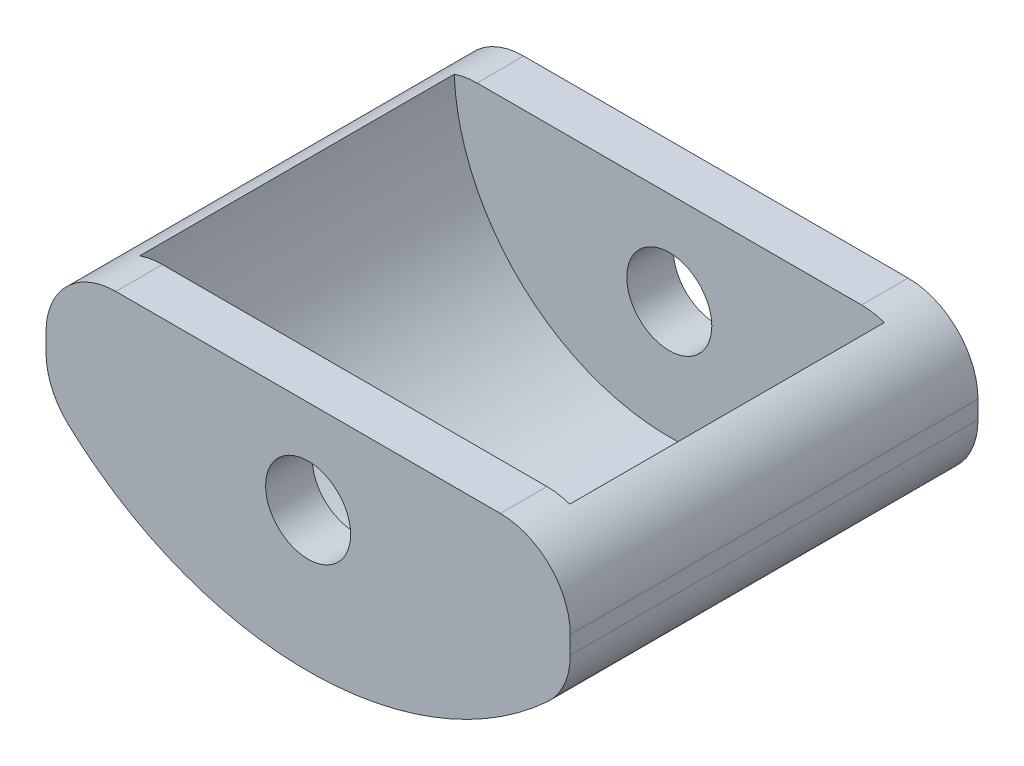
ISO-10303-21;
HEADER;
FILE_DESCRIPTION(('STEP AP214'),'2;1');
FILE_NAME('part.step','',(''),(''),'','','');
FILE_SCHEMA(('AUTOMOTIVE_DESIGN { 1 0 10303 214 1 1 1 1 }'));
ENDSEC;
DATA;
#1=APPLICATION_CONTEXT('core data for automotive mechanical design processes');
#2=APPLICATION_PROTOCOL_DEFINITION('international standard','automotive_design',2000,#1);
#3=PRODUCT_CONTEXT('',#1,'mechanical');
#4=PRODUCT('Part','Part','',(#3));
#5=PRODUCT_RELATED_PRODUCT_CATEGORY('part','',(#4));
#6=PRODUCT_DEFINITION_FORMATION('','',#4);
#7=PRODUCT_DEFINITION_CONTEXT('part definition',#1,'design');
#8=PRODUCT_DEFINITION('design','',#6,#7);
#9=PRODUCT_DEFINITION_SHAPE('','',#8);
#10=(LENGTH_UNIT() NAMED_UNIT(*) SI_UNIT(.MILLI.,.METRE.));
#11=(NAMED_UNIT(*) PLANE_ANGLE_UNIT() SI_UNIT($,.RADIAN.));
#12=(NAMED_UNIT(*) SI_UNIT($,.STERADIAN.) SOLID_ANGLE_UNIT());
#13=UNCERTAINTY_MEASURE_WITH_UNIT(LENGTH_MEASURE(1.E-05),#10,'distance_accuracy_value','');
#14=(GEOMETRIC_REPRESENTATION_CONTEXT(3) GLOBAL_UNCERTAINTY_ASSIGNED_CONTEXT((#13)) GLOBAL_UNIT_ASSIGNED_CONTEXT((#10,
#11,#12)) REPRESENTATION_CONTEXT('',''));
#15=CARTESIAN_POINT('',(0.,0.,0.));
#16=DIRECTION('',(0.,0.,1.));
#17=DIRECTION('',(1.,0.,0.));
#18=AXIS2_PLACEMENT_3D('',#15,#16,#17);
#19=CARTESIAN_POINT('',(0.,10.,0.));
#20=DIRECTION('',(0.,1.,0.));
#21=DIRECTION('',(0.,0.,1.));
#22=AXIS2_PLACEMENT_3D('',#19,#20,#21);
#23=PLANE('',#22);
#24=DIRECTION('',(1.,0.,0.));
#25=VECTOR('',#24,1.);
#26=CARTESIAN_POINT('',(-11.25,10.,8.75));
#27=LINE('',#26,#25);
#28=CARTESIAN_POINT('',(-8.25,10.,8.75));
#29=VERTEX_POINT('',#28);
#30=CARTESIAN_POINT('',(8.24999999999999,10.,8.75));
#31=VERTEX_POINT('',#30);
#32=EDGE_CURVE('E208',#29,#31,#27,.T.);
#33=ORIENTED_EDGE('',*,*,#32,.T.);
#34=DIRECTION('',(0.,0.,-1.));
#35=VECTOR('',#34,1.);
#36=CARTESIAN_POINT('',(8.25,10.,-8.75));
#37=LINE('',#36,#35);
#38=CARTESIAN_POINT('',(8.25,10.,6.75));
#39=VERTEX_POINT('',#38);
#40=EDGE_CURVE('E180',#31,#39,#37,.T.);
#41=ORIENTED_EDGE('',*,*,#40,.T.);
#42=DIRECTION('',(1.,0.,0.));
#43=VECTOR('',#42,1.);
#44=CARTESIAN_POINT('',(0.,10.,6.75));
#45=LINE('',#44,#43);
#46=CARTESIAN_POINT('',(-8.25,10.,6.75));
#47=VERTEX_POINT('',#46);
#48=EDGE_CURVE('E210',#47,#39,#45,.T.);
#49=ORIENTED_EDGE('',*,*,#48,.F.);
#50=DIRECTION('',(0.,0.,1.));
#51=VECTOR('',#50,1.);
#52=CARTESIAN_POINT('',(-8.25,10.,8.75));
#53=LINE('',#52,#51);
#54=EDGE_CURVE('E173',#47,#29,#53,.T.);
#55=ORIENTED_EDGE('',*,*,#54,.T.);
#56=EDGE_LOOP('',(#33,#41,#49,#55));
#57=FACE_BOUND('',#56,.T.);
#58=ADVANCED_FACE('F33',(#57),#23,.T.);
#59=CARTESIAN_POINT('',(0.,6.,-8.75));
#60=DIRECTION('',(0.,0.,1.));
#61=DIRECTION('',(1.,0.,0.));
#62=AXIS2_PLACEMENT_3D('',#59,#60,#61);
#63=CYLINDRICAL_SURFACE('',#62,1.825);
#64=CARTESIAN_POINT('',(0.,6.,8.75));
#65=DIRECTION('',(0.,0.,-1.));
#66=DIRECTION('',(-1.,0.,0.));
#67=AXIS2_PLACEMENT_3D('',#64,#65,#66);
#68=CIRCLE('',#67,1.825);
#69=CARTESIAN_POINT('',(-1.825,6.,8.75));
#70=VERTEX_POINT('',#69);
#71=EDGE_CURVE('E218',#70,#70,#68,.T.);
#72=ORIENTED_EDGE('',*,*,#71,.F.);
#73=EDGE_LOOP('',(#72));
#74=FACE_BOUND('',#73,.T.);
#75=CARTESIAN_POINT('',(0.,6.,6.75));
#76=DIRECTION('',(0.,0.,1.));
#77=DIRECTION('',(1.,0.,0.));
#78=AXIS2_PLACEMENT_3D('',#75,#76,#77);
#79=CIRCLE('',#78,1.825);
#80=CARTESIAN_POINT('',(1.825,6.,6.75));
#81=VERTEX_POINT('',#80);
#82=EDGE_CURVE('E234',#81,#81,#79,.F.);
#83=ORIENTED_EDGE('',*,*,#82,.T.);
#84=EDGE_LOOP('',(#83));
#85=FACE_BOUND('',#84,.T.);
#86=ADVANCED_FACE('F248',(#74,#85),#63,.F.);
#87=DIRECTION('',(1.,0.,0.));
#88=VECTOR('',#87,1.);
#89=CARTESIAN_POINT('',(0.,10.,-6.75));
#90=LINE('',#89,#88);
#91=CARTESIAN_POINT('',(-8.25,10.,-6.75));
#92=VERTEX_POINT('',#91);
#93=CARTESIAN_POINT('',(8.25,10.,-6.75));
#94=VERTEX_POINT('',#93);
#95=EDGE_CURVE('E289',#92,#94,#90,.T.);
#96=ORIENTED_EDGE('',*,*,#95,.T.);
#97=DIRECTION('',(0.,0.,-1.));
#98=VECTOR('',#97,1.);
#99=CARTESIAN_POINT('',(8.25,10.,-8.75));
#100=LINE('',#99,#98);
#101=CARTESIAN_POINT('',(8.24999999999999,10.,-8.75));
#102=VERTEX_POINT('',#101);
#103=EDGE_CURVE('E178',#94,#102,#100,.T.);
#104=ORIENTED_EDGE('',*,*,#103,.T.);
#105=DIRECTION('',(-1.,0.,0.));
#106=VECTOR('',#105,1.);
#107=CARTESIAN_POINT('',(-11.25,10.,-8.75));
#108=LINE('',#107,#106);
#109=CARTESIAN_POINT('',(-8.25,10.,-8.75));
#110=VERTEX_POINT('',#109);
#111=EDGE_CURVE('E217',#102,#110,#108,.T.);
#112=ORIENTED_EDGE('',*,*,#111,.T.);
#113=DIRECTION('',(0.,0.,1.));
#114=VECTOR('',#113,1.);
#115=CARTESIAN_POINT('',(-8.25,10.,8.75));
#116=LINE('',#115,#114);
#117=EDGE_CURVE('E175',#110,#92,#116,.T.);
#118=ORIENTED_EDGE('',*,*,#117,.T.);
#119=EDGE_LOOP('',(#96,#104,#112,#118));
#120=FACE_BOUND('',#119,.T.);
#121=ADVANCED_FACE('F245',(#120),#23,.T.);
#122=CARTESIAN_POINT('',(0.,6.,-8.75));
#123=DIRECTION('',(0.,0.,1.));
#124=DIRECTION('',(1.,0.,0.));
#125=AXIS2_PLACEMENT_3D('',#122,#123,#124);
#126=CIRCLE('',#125,1.825);
#127=CARTESIAN_POINT('',(1.825,6.,-8.75));
#128=VERTEX_POINT('',#127);
#129=EDGE_CURVE('E144',#128,#128,#126,.T.);
#130=ORIENTED_EDGE('',*,*,#129,.F.);
#131=EDGE_LOOP('',(#130));
#132=FACE_BOUND('',#131,.T.);
#133=CARTESIAN_POINT('',(0.,6.,-6.75));
#134=DIRECTION('',(0.,0.,1.));
#135=DIRECTION('',(1.,0.,0.));
#136=AXIS2_PLACEMENT_3D('',#133,#134,#135);
#137=CIRCLE('',#136,1.825);
#138=CARTESIAN_POINT('',(1.825,6.,-6.75));
#139=VERTEX_POINT('',#138);
#140=EDGE_CURVE('E152',#139,#139,#137,.F.);
#141=ORIENTED_EDGE('',*,*,#140,.F.);
#142=EDGE_LOOP('',(#141));
#143=FACE_BOUND('',#142,.T.);
#144=ADVANCED_FACE('F242',(#132,#143),#63,.F.);
#145=CARTESIAN_POINT('',(-11.25,10.,-8.75));
#146=DIRECTION('',(1.,0.,0.));
#147=DIRECTION('',(0.,0.,-1.));
#148=AXIS2_PLACEMENT_3D('',#145,#146,#147);
#149=PLANE('',#148);
#150=DIRECTION('',(0.,-1.,0.));
#151=VECTOR('',#150,1.);
#152=CARTESIAN_POINT('',(-11.25,10.,-8.75));
#153=LINE('',#152,#151);
#154=CARTESIAN_POINT('',(-11.25,7.,-8.75));
#155=VERTEX_POINT('',#154);
#156=CARTESIAN_POINT('',(-11.25,6.2307542689532,-8.75));
#157=VERTEX_POINT('',#156);
#158=EDGE_CURVE('E221',#155,#157,#153,.T.);
#159=ORIENTED_EDGE('',*,*,#158,.T.);
#160=DIRECTION('',(0.,0.,1.));
#161=VECTOR('',#160,1.);
#162=CARTESIAN_POINT('',(-11.25,6.2307542689532,-8.75));
#163=LINE('',#162,#161);
#164=CARTESIAN_POINT('',(-11.25,6.2307542689532,8.75));
#165=VERTEX_POINT('',#164);
#166=EDGE_CURVE('E170',#157,#165,#163,.T.);
#167=ORIENTED_EDGE('',*,*,#166,.T.);
#168=DIRECTION('',(0.,-1.,0.));
#169=VECTOR('',#168,1.);
#170=CARTESIAN_POINT('',(-11.25,10.,8.75));
#171=LINE('',#170,#169);
#172=CARTESIAN_POINT('',(-11.25,7.,8.75));
#173=VERTEX_POINT('',#172);
#174=EDGE_CURVE('E232',#173,#165,#171,.T.);
#175=ORIENTED_EDGE('',*,*,#174,.F.);
#176=DIRECTION('',(0.,0.,1.));
#177=VECTOR('',#176,1.);
#178=CARTESIAN_POINT('',(-11.25,7.,-8.75));
#179=LINE('',#178,#177);
#180=EDGE_CURVE('E132',#173,#155,#179,.F.);
#181=ORIENTED_EDGE('',*,*,#180,.T.);
#182=EDGE_LOOP('',(#159,#167,#175,#181));
#183=FACE_BOUND('',#182,.T.);
#184=ADVANCED_FACE('F244',(#183),#149,.F.);
#185=CARTESIAN_POINT('',(-11.25,10.,8.75));
#186=DIRECTION('',(0.,0.,-1.));
#187=DIRECTION('',(-1.,0.,0.));
#188=AXIS2_PLACEMENT_3D('',#185,#186,#187);
#189=PLANE('',#188);
#190=ORIENTED_EDGE('',*,*,#71,.T.);
#191=EDGE_LOOP('',(#190));
#192=FACE_BOUND('',#191,.T.);
#193=CARTESIAN_POINT('',(0.,15.1866132264529,8.75));
#194=DIRECTION('',(0.,0.,1.));
#195=DIRECTION('',(1.,0.,0.));
#196=AXIS2_PLACEMENT_3D('',#193,#194,#195);
#197=CIRCLE('',#196,15.1766132264529);
#198=CARTESIAN_POINT('',(10.2825848854452,4.02426414129347,8.75));
#199=VERTEX_POINT('',#198);
#200=CARTESIAN_POINT('',(-10.2825848854452,4.02426414129347,8.75));
#201=VERTEX_POINT('',#200);
#202=EDGE_CURVE('E143',#199,#201,#197,.F.);
#203=ORIENTED_EDGE('',*,*,#202,.F.);
#204=CARTESIAN_POINT('',(8.25,6.2307542689532,8.75));
#205=DIRECTION('',(0.,0.,-1.));
#206=DIRECTION('',(-1.,0.,0.));
#207=AXIS2_PLACEMENT_3D('',#204,#205,#206);
#208=CIRCLE('',#207,3.);
#209=CARTESIAN_POINT('',(11.25,6.2307542689532,8.75));
#210=VERTEX_POINT('',#209);
#211=EDGE_CURVE('E147',#199,#210,#208,.F.);
#212=ORIENTED_EDGE('',*,*,#211,.T.);
#213=DIRECTION('',(0.,-1.,0.));
#214=VECTOR('',#213,1.);
#215=CARTESIAN_POINT('',(11.25,10.,8.75));
#216=LINE('',#215,#214);
#217=CARTESIAN_POINT('',(11.25,7.,8.75));
#218=VERTEX_POINT('',#217);
#219=EDGE_CURVE('E229',#218,#210,#216,.T.);
#220=ORIENTED_EDGE('',*,*,#219,.F.);
#221=CARTESIAN_POINT('',(8.25,7.,8.75));
#222=DIRECTION('',(0.,0.,-1.));
#223=DIRECTION('',(-1.,0.,0.));
#224=AXIS2_PLACEMENT_3D('',#221,#222,#223);
#225=CIRCLE('',#224,3.);
#226=EDGE_CURVE('E150',#218,#31,#225,.F.);
#227=ORIENTED_EDGE('',*,*,#226,.T.);
#228=ORIENTED_EDGE('',*,*,#32,.F.);
#229=CARTESIAN_POINT('',(-8.25,7.,8.75));
#230=DIRECTION('',(0.,0.,-1.));
#231=DIRECTION('',(-1.,0.,0.));
#232=AXIS2_PLACEMENT_3D('',#229,#230,#231);
#233=CIRCLE('',#232,3.);
#234=EDGE_CURVE('E148',#29,#173,#233,.F.);
#235=ORIENTED_EDGE('',*,*,#234,.T.);
#236=ORIENTED_EDGE('',*,*,#174,.T.);
#237=CARTESIAN_POINT('',(-8.25,6.2307542689532,8.75));
#238=DIRECTION('',(0.,0.,-1.));
#239=DIRECTION('',(-1.,0.,0.));
#240=AXIS2_PLACEMENT_3D('',#237,#238,#239);
#241=CIRCLE('',#240,3.);
#242=EDGE_CURVE('E157',#165,#201,#241,.F.);
#243=ORIENTED_EDGE('',*,*,#242,.T.);
#244=EDGE_LOOP('',(#203,#212,#220,#227,#228,#235,#236,#243));
#245=FACE_BOUND('',#244,.T.);
#246=ADVANCED_FACE('F212',(#192,#245),#189,.F.);
#247=CARTESIAN_POINT('',(11.25,10.,-8.75));
#248=DIRECTION('',(-1.,0.,0.));
#249=DIRECTION('',(0.,0.,1.));
#250=AXIS2_PLACEMENT_3D('',#247,#248,#249);
#251=PLANE('',#250);
#252=ORIENTED_EDGE('',*,*,#219,.T.);
#253=DIRECTION('',(0.,0.,1.));
#254=VECTOR('',#253,1.);
#255=CARTESIAN_POINT('',(11.25,6.2307542689532,-8.75));
#256=LINE('',#255,#254);
#257=CARTESIAN_POINT('',(11.25,6.2307542689532,-8.75));
#258=VERTEX_POINT('',#257);
#259=EDGE_CURVE('E162',#210,#258,#256,.F.);
#260=ORIENTED_EDGE('',*,*,#259,.T.);
#261=DIRECTION('',(0.,-1.,0.));
#262=VECTOR('',#261,1.);
#263=CARTESIAN_POINT('',(11.25,10.,-8.75));
#264=LINE('',#263,#262);
#265=CARTESIAN_POINT('',(11.25,7.,-8.75));
#266=VERTEX_POINT('',#265);
#267=EDGE_CURVE('E128',#266,#258,#264,.T.);
#268=ORIENTED_EDGE('',*,*,#267,.F.);
#269=DIRECTION('',(0.,0.,-1.));
#270=VECTOR('',#269,1.);
#271=CARTESIAN_POINT('',(11.25,7.,8.75));
#272=LINE('',#271,#270);
#273=EDGE_CURVE('E160',#266,#218,#272,.F.);
#274=ORIENTED_EDGE('',*,*,#273,.T.);
#275=EDGE_LOOP('',(#252,#260,#268,#274));
#276=FACE_BOUND('',#275,.T.);
#277=ADVANCED_FACE('F268',(#276),#251,.F.);
#278=CARTESIAN_POINT('',(-11.25,10.,-8.75));
#279=DIRECTION('',(0.,0.,1.));
#280=DIRECTION('',(1.,0.,0.));
#281=AXIS2_PLACEMENT_3D('',#278,#279,#280);
#282=PLANE('',#281);
#283=ORIENTED_EDGE('',*,*,#129,.T.);
#284=EDGE_LOOP('',(#283));
#285=FACE_BOUND('',#284,.T.);
#286=ORIENTED_EDGE('',*,*,#267,.T.);
#287=CARTESIAN_POINT('',(8.25,6.2307542689532,-8.75));
#288=DIRECTION('',(0.,0.,1.));
#289=DIRECTION('',(1.,0.,0.));
#290=AXIS2_PLACEMENT_3D('',#287,#288,#289);
#291=CIRCLE('',#290,3.);
#292=CARTESIAN_POINT('',(10.2825848854452,4.02426414129347,-8.75));
#293=VERTEX_POINT('',#292);
#294=EDGE_CURVE('E122',#258,#293,#291,.F.);
#295=ORIENTED_EDGE('',*,*,#294,.T.);
#296=CARTESIAN_POINT('',(0.,15.1866132264529,-8.75));
#297=DIRECTION('',(0.,0.,-1.));
#298=DIRECTION('',(1.,0.,0.));
#299=AXIS2_PLACEMENT_3D('',#296,#297,#298);
#300=CIRCLE('',#299,15.1766132264529);
#301=CARTESIAN_POINT('',(-10.2825848854452,4.02426414129347,-8.75));
#302=VERTEX_POINT('',#301);
#303=EDGE_CURVE('E125',#293,#302,#300,.T.);
#304=ORIENTED_EDGE('',*,*,#303,.T.);
#305=CARTESIAN_POINT('',(-8.25,6.2307542689532,-8.75));
#306=DIRECTION('',(0.,0.,1.));
#307=DIRECTION('',(1.,0.,0.));
#308=AXIS2_PLACEMENT_3D('',#305,#306,#307);
#309=CIRCLE('',#308,3.);
#310=EDGE_CURVE('E133',#302,#157,#309,.F.);
#311=ORIENTED_EDGE('',*,*,#310,.T.);
#312=ORIENTED_EDGE('',*,*,#158,.F.);
#313=CARTESIAN_POINT('',(-8.25,7.,-8.75));
#314=DIRECTION('',(0.,0.,1.));
#315=DIRECTION('',(1.,0.,0.));
#316=AXIS2_PLACEMENT_3D('',#313,#314,#315);
#317=CIRCLE('',#316,3.);
#318=EDGE_CURVE('E164',#155,#110,#317,.F.);
#319=ORIENTED_EDGE('',*,*,#318,.T.);
#320=ORIENTED_EDGE('',*,*,#111,.F.);
#321=CARTESIAN_POINT('',(8.25,7.,-8.75));
#322=DIRECTION('',(0.,0.,1.));
#323=DIRECTION('',(1.,0.,0.));
#324=AXIS2_PLACEMENT_3D('',#321,#322,#323);
#325=CIRCLE('',#324,3.);
#326=EDGE_CURVE('E166',#102,#266,#325,.F.);
#327=ORIENTED_EDGE('',*,*,#326,.T.);
#328=EDGE_LOOP('',(#286,#295,#304,#311,#312,#319,#320,#327));
#329=FACE_BOUND('',#328,.T.);
#330=ADVANCED_FACE('F124',(#285,#329),#282,.F.);
#331=CARTESIAN_POINT('',(0.,15.1866132264529,-8.75));
#332=DIRECTION('',(0.,0.,1.));
#333=DIRECTION('',(1.,0.,0.));
#334=AXIS2_PLACEMENT_3D('',#331,#332,#333);
#335=CYLINDRICAL_SURFACE('',#334,15.1766132264529);
#336=ORIENTED_EDGE('',*,*,#303,.F.);
#337=DIRECTION('',(0.,0.,1.));
#338=VECTOR('',#337,1.);
#339=CARTESIAN_POINT('',(10.2825848854452,4.02426414129347,-8.75));
#340=LINE('',#339,#338);
#341=EDGE_CURVE('E139',#293,#199,#340,.T.);
#342=ORIENTED_EDGE('',*,*,#341,.T.);
#343=ORIENTED_EDGE('',*,*,#202,.T.);
#344=DIRECTION('',(0.,0.,1.));
#345=VECTOR('',#344,1.);
#346=CARTESIAN_POINT('',(-10.2825848854452,4.02426414129347,-8.75));
#347=LINE('',#346,#345);
#348=EDGE_CURVE('E142',#201,#302,#347,.F.);
#349=ORIENTED_EDGE('',*,*,#348,.T.);
#350=EDGE_LOOP('',(#336,#342,#343,#349));
#351=FACE_BOUND('',#350,.T.);
#352=ADVANCED_FACE('F137',(#351),#335,.T.);
#353=CARTESIAN_POINT('',(-3.75,10.1035611275534,-6.75));
#354=DIRECTION('',(0.,0.,1.));
#355=DIRECTION('',(1.,0.,0.));
#356=AXIS2_PLACEMENT_3D('',#353,#354,#355);
#357=PLANE('',#356);
#358=ORIENTED_EDGE('',*,*,#140,.T.);
#359=EDGE_LOOP('',(#358));
#360=FACE_BOUND('',#359,.T.);
#361=CARTESIAN_POINT('',(0.,10.2071222551068,-6.75));
#362=DIRECTION('',(0.,0.,1.));
#363=DIRECTION('',(1.,0.,0.));
#364=AXIS2_PLACEMENT_3D('',#361,#362,#363);
#365=CIRCLE('',#364,9.23746609130077);
#366=CARTESIAN_POINT('',(-9.22998484576561,9.83542407799429,-6.75));
#367=VERTEX_POINT('',#366);
#368=CARTESIAN_POINT('',(9.22998484576561,9.83542407799429,-6.75));
#369=VERTEX_POINT('',#368);
#370=EDGE_CURVE('E193',#367,#369,#365,.T.);
#371=ORIENTED_EDGE('',*,*,#370,.T.);
#372=CARTESIAN_POINT('',(8.25,7.,-6.75));
#373=DIRECTION('',(0.,0.,1.));
#374=DIRECTION('',(1.,0.,0.));
#375=AXIS2_PLACEMENT_3D('',#372,#373,#374);
#376=CIRCLE('',#375,3.);
#377=EDGE_CURVE('E11',#369,#94,#376,.T.);
#378=ORIENTED_EDGE('',*,*,#377,.T.);
#379=ORIENTED_EDGE('',*,*,#95,.F.);
#380=CARTESIAN_POINT('',(-8.25,7.,-6.75));
#381=DIRECTION('',(0.,0.,1.));
#382=DIRECTION('',(1.,0.,0.));
#383=AXIS2_PLACEMENT_3D('',#380,#381,#382);
#384=CIRCLE('',#383,3.);
#385=EDGE_CURVE('E41',#92,#367,#384,.T.);
#386=ORIENTED_EDGE('',*,*,#385,.T.);
#387=EDGE_LOOP('',(#371,#378,#379,#386));
#388=FACE_BOUND('',#387,.T.);
#389=ADVANCED_FACE('F240',(#360,#388),#357,.T.);
#390=CARTESIAN_POINT('',(-3.75,10.1035611275534,6.75));
#391=DIRECTION('',(0.,0.,1.));
#392=DIRECTION('',(1.,0.,0.));
#393=AXIS2_PLACEMENT_3D('',#390,#391,#392);
#394=PLANE('',#393);
#395=ORIENTED_EDGE('',*,*,#82,.F.);
#396=EDGE_LOOP('',(#395));
#397=FACE_BOUND('',#396,.T.);
#398=ORIENTED_EDGE('',*,*,#48,.T.);
#399=CARTESIAN_POINT('',(8.25,7.,6.75));
#400=DIRECTION('',(0.,0.,1.));
#401=DIRECTION('',(1.,0.,0.));
#402=AXIS2_PLACEMENT_3D('',#399,#400,#401);
#403=CIRCLE('',#402,3.);
#404=CARTESIAN_POINT('',(9.22998484576561,9.83542407799429,6.75));
#405=VERTEX_POINT('',#404);
#406=EDGE_CURVE('E185',#39,#405,#403,.F.);
#407=ORIENTED_EDGE('',*,*,#406,.T.);
#408=CARTESIAN_POINT('',(0.,10.2071222551068,6.75));
#409=DIRECTION('',(0.,0.,1.));
#410=DIRECTION('',(1.,0.,0.));
#411=AXIS2_PLACEMENT_3D('',#408,#409,#410);
#412=CIRCLE('',#411,9.23746609130077);
#413=CARTESIAN_POINT('',(-9.22998484576561,9.83542407799429,6.75));
#414=VERTEX_POINT('',#413);
#415=EDGE_CURVE('E192',#414,#405,#412,.T.);
#416=ORIENTED_EDGE('',*,*,#415,.F.);
#417=CARTESIAN_POINT('',(-8.25,7.,6.75));
#418=DIRECTION('',(0.,0.,1.));
#419=DIRECTION('',(1.,0.,0.));
#420=AXIS2_PLACEMENT_3D('',#417,#418,#419);
#421=CIRCLE('',#420,3.);
#422=EDGE_CURVE('E183',#414,#47,#421,.F.);
#423=ORIENTED_EDGE('',*,*,#422,.T.);
#424=EDGE_LOOP('',(#398,#407,#416,#423));
#425=FACE_BOUND('',#424,.T.);
#426=ADVANCED_FACE('F198',(#397,#425),#394,.F.);
#427=CARTESIAN_POINT('',(0.,10.2071222551068,-6.75));
#428=DIRECTION('',(0.,0.,1.));
#429=DIRECTION('',(1.,0.,0.));
#430=AXIS2_PLACEMENT_3D('',#427,#428,#429);
#431=CYLINDRICAL_SURFACE('',#430,9.23746609130077);
#432=ORIENTED_EDGE('',*,*,#415,.T.);
#433=DIRECTION('',(0.,0.,1.));
#434=VECTOR('',#433,1.);
#435=CARTESIAN_POINT('',(9.22998484576561,9.83542407799429,6.75));
#436=LINE('',#435,#434);
#437=EDGE_CURVE('E48',#405,#369,#436,.F.);
#438=ORIENTED_EDGE('',*,*,#437,.T.);
#439=ORIENTED_EDGE('',*,*,#370,.F.);
#440=DIRECTION('',(0.,0.,1.));
#441=VECTOR('',#440,1.);
#442=CARTESIAN_POINT('',(-9.22998484576561,9.83542407799429,-6.75));
#443=LINE('',#442,#441);
#444=EDGE_CURVE('E187',#367,#414,#443,.T.);
#445=ORIENTED_EDGE('',*,*,#444,.T.);
#446=EDGE_LOOP('',(#432,#438,#439,#445));
#447=FACE_BOUND('',#446,.T.);
#448=ADVANCED_FACE('F191',(#447),#431,.F.);
#449=CARTESIAN_POINT('',(8.25,6.2307542689532,-8.75));
#450=DIRECTION('',(0.,0.,1.));
#451=DIRECTION('',(1.,0.,0.));
#452=AXIS2_PLACEMENT_3D('',#449,#450,#451);
#453=CYLINDRICAL_SURFACE('',#452,3.);
#454=ORIENTED_EDGE('',*,*,#294,.F.);
#455=ORIENTED_EDGE('',*,*,#259,.F.);
#456=ORIENTED_EDGE('',*,*,#211,.F.);
#457=ORIENTED_EDGE('',*,*,#341,.F.);
#458=EDGE_LOOP('',(#454,#455,#456,#457));
#459=FACE_BOUND('',#458,.T.);
#460=ADVANCED_FACE('F146',(#459),#453,.T.);
#461=CARTESIAN_POINT('',(-8.25,6.2307542689532,-8.75));
#462=DIRECTION('',(0.,0.,1.));
#463=DIRECTION('',(1.,0.,0.));
#464=AXIS2_PLACEMENT_3D('',#461,#462,#463);
#465=CYLINDRICAL_SURFACE('',#464,3.);
#466=ORIENTED_EDGE('',*,*,#310,.F.);
#467=ORIENTED_EDGE('',*,*,#348,.F.);
#468=ORIENTED_EDGE('',*,*,#242,.F.);
#469=ORIENTED_EDGE('',*,*,#166,.F.);
#470=EDGE_LOOP('',(#466,#467,#468,#469));
#471=FACE_BOUND('',#470,.T.);
#472=ADVANCED_FACE('F278',(#471),#465,.T.);
#473=CARTESIAN_POINT('',(8.25,7.,0.));
#474=DIRECTION('',(0.,0.,1.));
#475=DIRECTION('',(1.,0.,0.));
#476=AXIS2_PLACEMENT_3D('',#473,#474,#475);
#477=CYLINDRICAL_SURFACE('',#476,3.);
#478=ORIENTED_EDGE('',*,*,#226,.F.);
#479=ORIENTED_EDGE('',*,*,#273,.F.);
#480=ORIENTED_EDGE('',*,*,#326,.F.);
#481=ORIENTED_EDGE('',*,*,#103,.F.);
#482=ORIENTED_EDGE('',*,*,#377,.F.);
#483=ORIENTED_EDGE('',*,*,#437,.F.);
#484=ORIENTED_EDGE('',*,*,#406,.F.);
#485=ORIENTED_EDGE('',*,*,#40,.F.);
#486=EDGE_LOOP('',(#478,#479,#480,#481,#482,#483,#484,#485));
#487=FACE_BOUND('',#486,.T.);
#488=ADVANCED_FACE('F280',(#487),#477,.T.);
#489=CARTESIAN_POINT('',(-8.25,7.,0.));
#490=DIRECTION('',(0.,0.,-1.));
#491=DIRECTION('',(-1.,0.,0.));
#492=AXIS2_PLACEMENT_3D('',#489,#490,#491);
#493=CYLINDRICAL_SURFACE('',#492,3.);
#494=ORIENTED_EDGE('',*,*,#318,.F.);
#495=ORIENTED_EDGE('',*,*,#180,.F.);
#496=ORIENTED_EDGE('',*,*,#234,.F.);
#497=ORIENTED_EDGE('',*,*,#54,.F.);
#498=ORIENTED_EDGE('',*,*,#422,.F.);
#499=ORIENTED_EDGE('',*,*,#444,.F.);
#500=ORIENTED_EDGE('',*,*,#385,.F.);
#501=ORIENTED_EDGE('',*,*,#117,.F.);
#502=EDGE_LOOP('',(#494,#495,#496,#497,#498,#499,#500,#501));
#503=FACE_BOUND('',#502,.T.);
#504=ADVANCED_FACE('F35',(#503),#493,.T.);
#505=CLOSED_SHELL('',(#58,#86,#121,#144,#184,#246,#277,#330,#352,#389,#426,#448,#460,#472,#488,#504));
#506=MANIFOLD_SOLID_BREP('B2',#505);
#507=ADVANCED_BREP_SHAPE_REPRESENTATION('',(#18,#506),#14);
#508=SHAPE_DEFINITION_REPRESENTATION(#9,#507);
ENDSEC;
END-ISO-10303-21;
